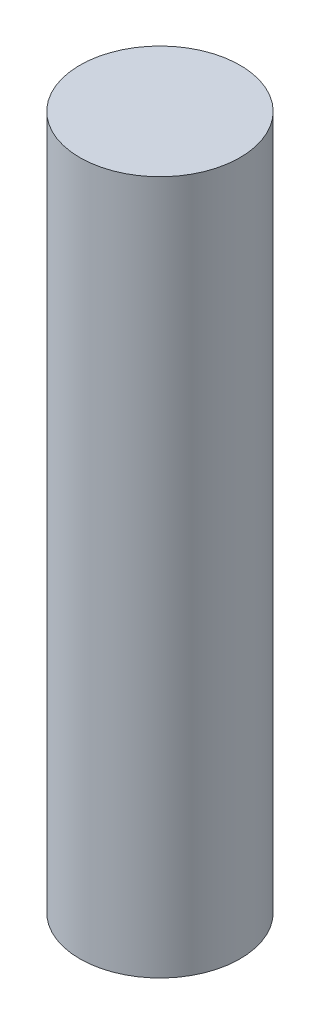
ISO-10303-21;
HEADER;
FILE_DESCRIPTION(('STEP AP214'),'2;1');
FILE_NAME('part.step','',(''),(''),'','','');
FILE_SCHEMA(('AUTOMOTIVE_DESIGN { 1 0 10303 214 1 1 1 1 }'));
ENDSEC;
DATA;
#1=APPLICATION_CONTEXT('core data for automotive mechanical design processes');
#2=APPLICATION_PROTOCOL_DEFINITION('international standard','automotive_design',2000,#1);
#3=PRODUCT_CONTEXT('',#1,'mechanical');
#4=PRODUCT('Part','Part','',(#3));
#5=PRODUCT_RELATED_PRODUCT_CATEGORY('part','',(#4));
#6=PRODUCT_DEFINITION_FORMATION('','',#4);
#7=PRODUCT_DEFINITION_CONTEXT('part definition',#1,'design');
#8=PRODUCT_DEFINITION('design','',#6,#7);
#9=PRODUCT_DEFINITION_SHAPE('','',#8);
#10=(LENGTH_UNIT() NAMED_UNIT(*) SI_UNIT(.MILLI.,.METRE.));
#11=(NAMED_UNIT(*) PLANE_ANGLE_UNIT() SI_UNIT($,.RADIAN.));
#12=(NAMED_UNIT(*) SI_UNIT($,.STERADIAN.) SOLID_ANGLE_UNIT());
#13=UNCERTAINTY_MEASURE_WITH_UNIT(LENGTH_MEASURE(1.E-05),#10,'distance_accuracy_value','');
#14=(GEOMETRIC_REPRESENTATION_CONTEXT(3) GLOBAL_UNCERTAINTY_ASSIGNED_CONTEXT((#13)) GLOBAL_UNIT_ASSIGNED_CONTEXT((#10,
#11,#12)) REPRESENTATION_CONTEXT('',''));
#15=CARTESIAN_POINT('',(0.,0.,0.));
#16=DIRECTION('',(0.,0.,1.));
#17=DIRECTION('',(1.,0.,0.));
#18=AXIS2_PLACEMENT_3D('',#15,#16,#17);
#19=CARTESIAN_POINT('',(0.,3.43916,0.));
#20=DIRECTION('',(0.,-1.,0.));
#21=DIRECTION('',(0.,0.,-1.));
#22=AXIS2_PLACEMENT_3D('',#19,#20,#21);
#23=CYLINDRICAL_SURFACE('',#22,0.396875);
#24=CARTESIAN_POINT('',(0.,3.43916,0.));
#25=DIRECTION('',(0.,1.,0.));
#26=DIRECTION('',(0.,0.,1.));
#27=AXIS2_PLACEMENT_3D('',#24,#25,#26);
#28=CIRCLE('',#27,0.396875);
#29=CARTESIAN_POINT('',(0.,3.43916,0.396875));
#30=VERTEX_POINT('',#29);
#31=EDGE_CURVE('E10',#30,#30,#28,.T.);
#32=ORIENTED_EDGE('',*,*,#31,.F.);
#33=EDGE_LOOP('',(#32));
#34=FACE_BOUND('',#33,.T.);
#35=CARTESIAN_POINT('',(0.,0.,0.));
#36=DIRECTION('',(0.,1.,0.));
#37=DIRECTION('',(0.,0.,1.));
#38=AXIS2_PLACEMENT_3D('',#35,#36,#37);
#39=CIRCLE('',#38,0.396875);
#40=CARTESIAN_POINT('',(0.,0.,0.396875));
#41=VERTEX_POINT('',#40);
#42=EDGE_CURVE('E44',#41,#41,#39,.T.);
#43=ORIENTED_EDGE('',*,*,#42,.T.);
#44=EDGE_LOOP('',(#43));
#45=FACE_BOUND('',#44,.T.);
#46=ADVANCED_FACE('F41',(#34,#45),#23,.T.);
#47=CARTESIAN_POINT('',(0.,3.43916,0.));
#48=DIRECTION('',(0.,1.,0.));
#49=DIRECTION('',(0.,0.,1.));
#50=AXIS2_PLACEMENT_3D('',#47,#48,#49);
#51=PLANE('',#50);
#52=ORIENTED_EDGE('',*,*,#31,.T.);
#53=EDGE_LOOP('',(#52));
#54=FACE_BOUND('',#53,.T.);
#55=ADVANCED_FACE('F56',(#54),#51,.T.);
#56=CARTESIAN_POINT('',(0.,0.,0.));
#57=DIRECTION('',(0.,1.,0.));
#58=DIRECTION('',(0.,0.,1.));
#59=AXIS2_PLACEMENT_3D('',#56,#57,#58);
#60=PLANE('',#59);
#61=ORIENTED_EDGE('',*,*,#42,.F.);
#62=EDGE_LOOP('',(#61));
#63=FACE_BOUND('',#62,.T.);
#64=ADVANCED_FACE('F54',(#63),#60,.F.);
#65=CLOSED_SHELL('',(#46,#55,#64));
#66=MANIFOLD_SOLID_BREP('B2',#65);
#67=ADVANCED_BREP_SHAPE_REPRESENTATION('',(#18,#66),#14);
#68=SHAPE_DEFINITION_REPRESENTATION(#9,#67);
ENDSEC;
END-ISO-10303-21;
